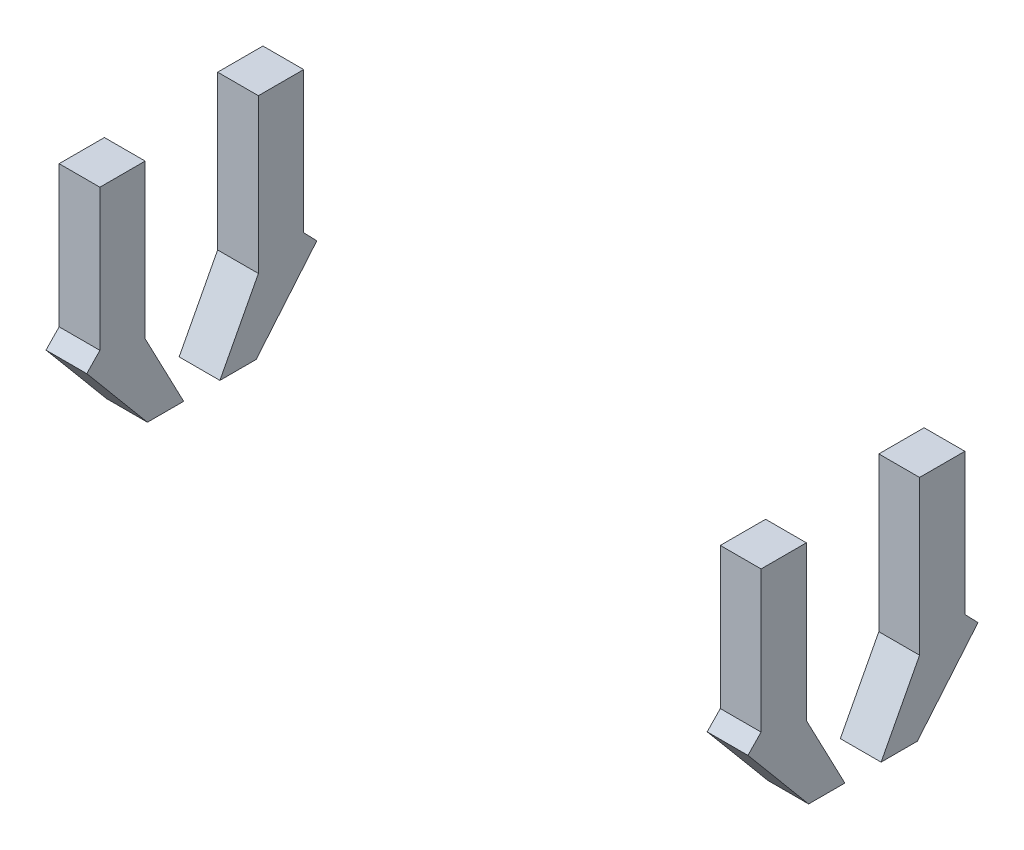
ISO-10303-21;
HEADER;
FILE_DESCRIPTION(('STEP AP214'),'2;1');
FILE_NAME('part.step','',(''),(''),'','','');
FILE_SCHEMA(('AUTOMOTIVE_DESIGN { 1 0 10303 214 1 1 1 1 }'));
ENDSEC;
DATA;
#1=APPLICATION_CONTEXT('core data for automotive mechanical design processes');
#2=APPLICATION_PROTOCOL_DEFINITION('international standard','automotive_design',2000,#1);
#3=PRODUCT_CONTEXT('',#1,'mechanical');
#4=PRODUCT('Part','Part','',(#3));
#5=PRODUCT_RELATED_PRODUCT_CATEGORY('part','',(#4));
#6=PRODUCT_DEFINITION_FORMATION('','',#4);
#7=PRODUCT_DEFINITION_CONTEXT('part definition',#1,'design');
#8=PRODUCT_DEFINITION('design','',#6,#7);
#9=PRODUCT_DEFINITION_SHAPE('','',#8);
#10=(LENGTH_UNIT() NAMED_UNIT(*) SI_UNIT(.MILLI.,.METRE.));
#11=(NAMED_UNIT(*) PLANE_ANGLE_UNIT() SI_UNIT($,.RADIAN.));
#12=(NAMED_UNIT(*) SI_UNIT($,.STERADIAN.) SOLID_ANGLE_UNIT());
#13=UNCERTAINTY_MEASURE_WITH_UNIT(LENGTH_MEASURE(1.E-05),#10,'distance_accuracy_value','');
#14=(GEOMETRIC_REPRESENTATION_CONTEXT(3) GLOBAL_UNCERTAINTY_ASSIGNED_CONTEXT((#13)) GLOBAL_UNIT_ASSIGNED_CONTEXT((#10,
#11,#12)) REPRESENTATION_CONTEXT('',''));
#15=CARTESIAN_POINT('',(0.,0.,0.));
#16=DIRECTION('',(0.,0.,1.));
#17=DIRECTION('',(1.,0.,0.));
#18=AXIS2_PLACEMENT_3D('',#15,#16,#17);
#19=CARTESIAN_POINT('',(-3.425,-3.43,1.48));
#20=DIRECTION('',(0.,0.,-1.));
#21=DIRECTION('',(0.,-1.,0.));
#22=AXIS2_PLACEMENT_3D('',#19,#20,#21);
#23=PLANE('',#22);
#24=DIRECTION('',(1.,0.,0.));
#25=VECTOR('',#24,1.);
#26=CARTESIAN_POINT('',(-3.875,-3.43,1.48));
#27=LINE('',#26,#25);
#28=CARTESIAN_POINT('',(-3.875,-3.43,1.48));
#29=VERTEX_POINT('',#28);
#30=CARTESIAN_POINT('',(-3.425,-3.43,1.48));
#31=VERTEX_POINT('',#30);
#32=EDGE_CURVE('P0_E101',#29,#31,#27,.T.);
#33=ORIENTED_EDGE('',*,*,#32,.F.);
#34=DIRECTION('',(0.,-1.,0.));
#35=VECTOR('',#34,1.);
#36=CARTESIAN_POINT('',(-3.875,-3.43,1.48));
#37=LINE('',#36,#35);
#38=CARTESIAN_POINT('',(-3.875,-4.99,1.48));
#39=VERTEX_POINT('',#38);
#40=EDGE_CURVE('P0_E144',#29,#39,#37,.T.);
#41=ORIENTED_EDGE('',*,*,#40,.T.);
#42=DIRECTION('',(-1.,0.,0.));
#43=VECTOR('',#42,1.);
#44=CARTESIAN_POINT('',(-3.425,-4.99,1.48));
#45=LINE('',#44,#43);
#46=CARTESIAN_POINT('',(-3.425,-4.99,1.48));
#47=VERTEX_POINT('',#46);
#48=EDGE_CURVE('P0_E11',#47,#39,#45,.T.);
#49=ORIENTED_EDGE('',*,*,#48,.F.);
#50=DIRECTION('',(0.,-1.,0.));
#51=VECTOR('',#50,1.);
#52=CARTESIAN_POINT('',(-3.425,-3.43,1.48));
#53=LINE('',#52,#51);
#54=EDGE_CURVE('P0_E97',#31,#47,#53,.T.);
#55=ORIENTED_EDGE('',*,*,#54,.F.);
#56=EDGE_LOOP('',(#33,#41,#49,#55));
#57=FACE_BOUND('',#56,.T.);
#58=ADVANCED_FACE('P0_F17',(#57),#23,.F.);
#59=CARTESIAN_POINT('',(-3.425,-4.99,1.48));
#60=DIRECTION('',(0.,-0.695022096847285,-0.718988376049295));
#61=DIRECTION('',(0.,-0.718988376049295,0.695022096847285));
#62=AXIS2_PLACEMENT_3D('',#59,#60,#61);
#63=PLANE('',#62);
#64=DIRECTION('',(0.,-0.718988376049295,0.695022096847285));
#65=VECTOR('',#64,1.);
#66=CARTESIAN_POINT('',(-3.425,-4.99,1.48));
#67=LINE('',#66,#65);
#68=CARTESIAN_POINT('',(-3.425,-5.14,1.625));
#69=VERTEX_POINT('',#68);
#70=EDGE_CURVE('P0_E107',#47,#69,#67,.T.);
#71=ORIENTED_EDGE('',*,*,#70,.F.);
#72=ORIENTED_EDGE('',*,*,#48,.T.);
#73=DIRECTION('',(0.,-0.718988376049295,0.695022096847285));
#74=VECTOR('',#73,1.);
#75=CARTESIAN_POINT('',(-3.875,-4.99,1.48));
#76=LINE('',#75,#74);
#77=CARTESIAN_POINT('',(-3.875,-5.14,1.625));
#78=VERTEX_POINT('',#77);
#79=EDGE_CURVE('P0_E151',#39,#78,#76,.T.);
#80=ORIENTED_EDGE('',*,*,#79,.T.);
#81=DIRECTION('',(-1.,0.,0.));
#82=VECTOR('',#81,1.);
#83=CARTESIAN_POINT('',(-3.425,-5.14,1.625));
#84=LINE('',#83,#82);
#85=EDGE_CURVE('P0_E26',#69,#78,#84,.T.);
#86=ORIENTED_EDGE('',*,*,#85,.F.);
#87=EDGE_LOOP('',(#71,#72,#80,#86));
#88=FACE_BOUND('',#87,.T.);
#89=ADVANCED_FACE('P0_F19',(#88),#63,.F.);
#90=CARTESIAN_POINT('',(-3.425,-5.14,1.625));
#91=DIRECTION('',(0.,0.642067671977776,-0.766647966540732));
#92=DIRECTION('',(-1.,0.,0.));
#93=AXIS2_PLACEMENT_3D('',#90,#91,#92);
#94=PLANE('',#93);
#95=DIRECTION('',(0.,-0.766647966540732,-0.642067671977776));
#96=VECTOR('',#95,1.);
#97=CARTESIAN_POINT('',(-3.425,-5.14,1.625));
#98=LINE('',#97,#96);
#99=CARTESIAN_POINT('',(-3.425,-5.94,0.955));
#100=VERTEX_POINT('',#99);
#101=EDGE_CURVE('P0_E147',#69,#100,#98,.T.);
#102=ORIENTED_EDGE('',*,*,#101,.F.);
#103=ORIENTED_EDGE('',*,*,#85,.T.);
#104=DIRECTION('',(0.,-0.766647966540732,-0.642067671977776));
#105=VECTOR('',#104,1.);
#106=CARTESIAN_POINT('',(-3.875,-5.14,1.625));
#107=LINE('',#106,#105);
#108=CARTESIAN_POINT('',(-3.875,-5.94,0.955));
#109=VERTEX_POINT('',#108);
#110=EDGE_CURVE('P0_E150',#78,#109,#107,.T.);
#111=ORIENTED_EDGE('',*,*,#110,.T.);
#112=DIRECTION('',(-1.,0.,0.));
#113=VECTOR('',#112,1.);
#114=CARTESIAN_POINT('',(-3.425,-5.94,0.955));
#115=LINE('',#114,#113);
#116=EDGE_CURVE('P0_E48',#100,#109,#115,.T.);
#117=ORIENTED_EDGE('',*,*,#116,.F.);
#118=EDGE_LOOP('',(#102,#103,#111,#117));
#119=FACE_BOUND('',#118,.T.);
#120=ADVANCED_FACE('P0_F170',(#119),#94,.F.);
#121=CARTESIAN_POINT('',(-3.425,-5.94,0.955));
#122=DIRECTION('',(0.,1.,0.));
#123=DIRECTION('',(1.,0.,0.));
#124=AXIS2_PLACEMENT_3D('',#121,#122,#123);
#125=PLANE('',#124);
#126=DIRECTION('',(0.,0.,-1.));
#127=VECTOR('',#126,1.);
#128=CARTESIAN_POINT('',(-3.425,-5.94,0.955));
#129=LINE('',#128,#127);
#130=CARTESIAN_POINT('',(-3.425,-5.94,0.555));
#131=VERTEX_POINT('',#130);
#132=EDGE_CURVE('P0_E134',#100,#131,#129,.T.);
#133=ORIENTED_EDGE('',*,*,#132,.F.);
#134=ORIENTED_EDGE('',*,*,#116,.T.);
#135=DIRECTION('',(0.,0.,-1.));
#136=VECTOR('',#135,1.);
#137=CARTESIAN_POINT('',(-3.875,-5.94,0.955));
#138=LINE('',#137,#136);
#139=CARTESIAN_POINT('',(-3.875,-5.94,0.555));
#140=VERTEX_POINT('',#139);
#141=EDGE_CURVE('P0_E141',#109,#140,#138,.T.);
#142=ORIENTED_EDGE('',*,*,#141,.T.);
#143=DIRECTION('',(-1.,0.,0.));
#144=VECTOR('',#143,1.);
#145=CARTESIAN_POINT('',(-3.425,-5.94,0.555));
#146=LINE('',#145,#144);
#147=EDGE_CURVE('P0_E38',#131,#140,#146,.T.);
#148=ORIENTED_EDGE('',*,*,#147,.F.);
#149=EDGE_LOOP('',(#133,#134,#142,#148));
#150=FACE_BOUND('',#149,.T.);
#151=ADVANCED_FACE('P0_F194',(#150),#125,.F.);
#152=CARTESIAN_POINT('',(-3.425,-5.94,0.555));
#153=DIRECTION('',(0.,-0.464619633020914,0.885510359403836));
#154=DIRECTION('',(-1.,0.,0.));
#155=AXIS2_PLACEMENT_3D('',#152,#153,#154);
#156=PLANE('',#155);
#157=DIRECTION('',(0.,0.885510359403836,0.464619633020914));
#158=VECTOR('',#157,1.);
#159=CARTESIAN_POINT('',(-3.425,-5.94,0.555));
#160=LINE('',#159,#158);
#161=CARTESIAN_POINT('',(-3.425,-5.13,0.98));
#162=VERTEX_POINT('',#161);
#163=EDGE_CURVE('P0_E160',#131,#162,#160,.T.);
#164=ORIENTED_EDGE('',*,*,#163,.F.);
#165=ORIENTED_EDGE('',*,*,#147,.T.);
#166=DIRECTION('',(0.,0.885510359403836,0.464619633020914));
#167=VECTOR('',#166,1.);
#168=CARTESIAN_POINT('',(-3.875,-5.94,0.555));
#169=LINE('',#168,#167);
#170=CARTESIAN_POINT('',(-3.875,-5.13,0.98));
#171=VERTEX_POINT('',#170);
#172=EDGE_CURVE('P0_E137',#140,#171,#169,.T.);
#173=ORIENTED_EDGE('',*,*,#172,.T.);
#174=DIRECTION('',(-1.,0.,0.));
#175=VECTOR('',#174,1.);
#176=CARTESIAN_POINT('',(-3.425,-5.13,0.98));
#177=LINE('',#176,#175);
#178=EDGE_CURVE('P0_E163',#162,#171,#177,.T.);
#179=ORIENTED_EDGE('',*,*,#178,.F.);
#180=EDGE_LOOP('',(#164,#165,#173,#179));
#181=FACE_BOUND('',#180,.T.);
#182=ADVANCED_FACE('P0_F192',(#181),#156,.F.);
#183=CARTESIAN_POINT('',(-3.425,-5.13,0.98));
#184=DIRECTION('',(0.,0.,1.));
#185=DIRECTION('',(1.,0.,0.));
#186=AXIS2_PLACEMENT_3D('',#183,#184,#185);
#187=PLANE('',#186);
#188=DIRECTION('',(1.,0.,0.));
#189=VECTOR('',#188,1.);
#190=CARTESIAN_POINT('',(-3.875,-3.43,0.98));
#191=LINE('',#190,#189);
#192=CARTESIAN_POINT('',(-3.875,-3.43,0.98));
#193=VERTEX_POINT('',#192);
#194=CARTESIAN_POINT('',(-3.425,-3.43,0.98));
#195=VERTEX_POINT('',#194);
#196=EDGE_CURVE('P0_E130',#193,#195,#191,.T.);
#197=ORIENTED_EDGE('',*,*,#196,.T.);
#198=DIRECTION('',(0.,1.,0.));
#199=VECTOR('',#198,1.);
#200=CARTESIAN_POINT('',(-3.425,-5.13,0.98));
#201=LINE('',#200,#199);
#202=EDGE_CURVE('P0_E108',#162,#195,#201,.T.);
#203=ORIENTED_EDGE('',*,*,#202,.F.);
#204=ORIENTED_EDGE('',*,*,#178,.T.);
#205=DIRECTION('',(0.,1.,0.));
#206=VECTOR('',#205,1.);
#207=CARTESIAN_POINT('',(-3.875,-5.13,0.98));
#208=LINE('',#207,#206);
#209=EDGE_CURVE('P0_E119',#171,#193,#208,.T.);
#210=ORIENTED_EDGE('',*,*,#209,.T.);
#211=EDGE_LOOP('',(#197,#203,#204,#210));
#212=FACE_BOUND('',#211,.T.);
#213=ADVANCED_FACE('P0_F190',(#212),#187,.F.);
#214=CARTESIAN_POINT('',(-3.425,0.,0.));
#215=DIRECTION('',(1.,0.,0.));
#216=DIRECTION('',(0.,1.,0.));
#217=AXIS2_PLACEMENT_3D('',#214,#215,#216);
#218=PLANE('',#217);
#219=ORIENTED_EDGE('',*,*,#202,.T.);
#220=DIRECTION('',(0.,0.,-1.));
#221=VECTOR('',#220,1.);
#222=CARTESIAN_POINT('',(-3.425,-3.43,1.48));
#223=LINE('',#222,#221);
#224=EDGE_CURVE('P0_E111',#31,#195,#223,.T.);
#225=ORIENTED_EDGE('',*,*,#224,.F.);
#226=ORIENTED_EDGE('',*,*,#54,.T.);
#227=ORIENTED_EDGE('',*,*,#70,.T.);
#228=ORIENTED_EDGE('',*,*,#101,.T.);
#229=ORIENTED_EDGE('',*,*,#132,.T.);
#230=ORIENTED_EDGE('',*,*,#163,.T.);
#231=EDGE_LOOP('',(#219,#225,#226,#227,#228,#229,#230));
#232=FACE_BOUND('',#231,.T.);
#233=ADVANCED_FACE('P0_F112',(#232),#218,.T.);
#234=CARTESIAN_POINT('',(-3.875,0.,0.));
#235=DIRECTION('',(1.,0.,0.));
#236=DIRECTION('',(0.,1.,0.));
#237=AXIS2_PLACEMENT_3D('',#234,#235,#236);
#238=PLANE('',#237);
#239=ORIENTED_EDGE('',*,*,#209,.F.);
#240=ORIENTED_EDGE('',*,*,#172,.F.);
#241=ORIENTED_EDGE('',*,*,#141,.F.);
#242=ORIENTED_EDGE('',*,*,#110,.F.);
#243=ORIENTED_EDGE('',*,*,#79,.F.);
#244=ORIENTED_EDGE('',*,*,#40,.F.);
#245=DIRECTION('',(0.,0.,-1.));
#246=VECTOR('',#245,1.);
#247=CARTESIAN_POINT('',(-3.875,-3.43,1.48));
#248=LINE('',#247,#246);
#249=EDGE_CURVE('P0_E123',#29,#193,#248,.T.);
#250=ORIENTED_EDGE('',*,*,#249,.T.);
#251=EDGE_LOOP('',(#239,#240,#241,#242,#243,#244,#250));
#252=FACE_BOUND('',#251,.T.);
#253=ADVANCED_FACE('P0_F177',(#252),#238,.F.);
#254=CARTESIAN_POINT('',(-3.281838299434,-3.43,1.624574185771));
#255=DIRECTION('',(0.,1.,0.));
#256=DIRECTION('',(1.,0.,0.));
#257=AXIS2_PLACEMENT_3D('',#254,#255,#256);
#258=PLANE('',#257);
#259=ORIENTED_EDGE('',*,*,#196,.F.);
#260=ORIENTED_EDGE('',*,*,#249,.F.);
#261=ORIENTED_EDGE('',*,*,#32,.T.);
#262=ORIENTED_EDGE('',*,*,#224,.T.);
#263=EDGE_LOOP('',(#259,#260,#261,#262));
#264=FACE_BOUND('',#263,.T.);
#265=ADVANCED_FACE('P0_F121',(#264),#258,.T.);
#266=CLOSED_SHELL('',(#58,#89,#120,#151,#182,#213,#233,#253,#265));
#267=MANIFOLD_SOLID_BREP('P0_B1',#266);
#268=CARTESIAN_POINT('',(2.93914547999,-3.43,1.870179127179));
#269=DIRECTION('',(0.,1.,0.));
#270=DIRECTION('',(1.,0.,0.));
#271=AXIS2_PLACEMENT_3D('',#268,#269,#270);
#272=PLANE('',#271);
#273=DIRECTION('',(-1.,0.,0.));
#274=VECTOR('',#273,1.);
#275=CARTESIAN_POINT('',(3.875,-3.43,1.48));
#276=LINE('',#275,#274);
#277=CARTESIAN_POINT('',(3.875,-3.43,1.48));
#278=VERTEX_POINT('',#277);
#279=CARTESIAN_POINT('',(3.425,-3.43,1.48));
#280=VERTEX_POINT('',#279);
#281=EDGE_CURVE('P1_E83',#278,#280,#276,.T.);
#282=ORIENTED_EDGE('',*,*,#281,.F.);
#283=DIRECTION('',(0.,0.,-1.));
#284=VECTOR('',#283,1.);
#285=CARTESIAN_POINT('',(3.875,-3.43,1.48));
#286=LINE('',#285,#284);
#287=CARTESIAN_POINT('',(3.875,-3.43,0.98));
#288=VERTEX_POINT('',#287);
#289=EDGE_CURVE('P1_E11',#278,#288,#286,.T.);
#290=ORIENTED_EDGE('',*,*,#289,.T.);
#291=DIRECTION('',(-1.,0.,0.));
#292=VECTOR('',#291,1.);
#293=CARTESIAN_POINT('',(3.875,-3.43,0.98));
#294=LINE('',#293,#292);
#295=CARTESIAN_POINT('',(3.425,-3.43,0.98));
#296=VERTEX_POINT('',#295);
#297=EDGE_CURVE('P1_E110',#288,#296,#294,.T.);
#298=ORIENTED_EDGE('',*,*,#297,.T.);
#299=DIRECTION('',(0.,0.,-1.));
#300=VECTOR('',#299,1.);
#301=CARTESIAN_POINT('',(3.425,-3.43,1.48));
#302=LINE('',#301,#300);
#303=EDGE_CURVE('P1_E72',#280,#296,#302,.T.);
#304=ORIENTED_EDGE('',*,*,#303,.F.);
#305=EDGE_LOOP('',(#282,#290,#298,#304));
#306=FACE_BOUND('',#305,.T.);
#307=ADVANCED_FACE('P1_F17',(#306),#272,.T.);
#308=CARTESIAN_POINT('',(3.875,0.,0.));
#309=DIRECTION('',(1.,0.,0.));
#310=DIRECTION('',(0.,1.,0.));
#311=AXIS2_PLACEMENT_3D('',#308,#309,#310);
#312=PLANE('',#311);
#313=ORIENTED_EDGE('',*,*,#289,.F.);
#314=DIRECTION('',(0.,-1.,0.));
#315=VECTOR('',#314,1.);
#316=CARTESIAN_POINT('',(3.875,-3.43,1.48));
#317=LINE('',#316,#315);
#318=CARTESIAN_POINT('',(3.875,-4.99,1.48));
#319=VERTEX_POINT('',#318);
#320=EDGE_CURVE('P1_E62',#278,#319,#317,.T.);
#321=ORIENTED_EDGE('',*,*,#320,.T.);
#322=DIRECTION('',(0.,-0.718988376049295,0.695022096847285));
#323=VECTOR('',#322,1.);
#324=CARTESIAN_POINT('',(3.875,-4.99,1.48));
#325=LINE('',#324,#323);
#326=CARTESIAN_POINT('',(3.875,-5.14,1.625));
#327=VERTEX_POINT('',#326);
#328=EDGE_CURVE('P1_E67',#319,#327,#325,.T.);
#329=ORIENTED_EDGE('',*,*,#328,.T.);
#330=DIRECTION('',(0.,-0.766647966540732,-0.642067671977776));
#331=VECTOR('',#330,1.);
#332=CARTESIAN_POINT('',(3.875,-5.14,1.625));
#333=LINE('',#332,#331);
#334=CARTESIAN_POINT('',(3.875,-5.94,0.955));
#335=VERTEX_POINT('',#334);
#336=EDGE_CURVE('P1_E140',#327,#335,#333,.T.);
#337=ORIENTED_EDGE('',*,*,#336,.T.);
#338=DIRECTION('',(0.,0.,-1.));
#339=VECTOR('',#338,1.);
#340=CARTESIAN_POINT('',(3.875,-5.94,0.955));
#341=LINE('',#340,#339);
#342=CARTESIAN_POINT('',(3.875,-5.94,0.555));
#343=VERTEX_POINT('',#342);
#344=EDGE_CURVE('P1_E150',#335,#343,#341,.T.);
#345=ORIENTED_EDGE('',*,*,#344,.T.);
#346=DIRECTION('',(0.,0.885510359403836,0.464619633020914));
#347=VECTOR('',#346,1.);
#348=CARTESIAN_POINT('',(3.875,-5.94,0.555));
#349=LINE('',#348,#347);
#350=CARTESIAN_POINT('',(3.875,-5.13,0.98));
#351=VERTEX_POINT('',#350);
#352=EDGE_CURVE('P1_E121',#343,#351,#349,.T.);
#353=ORIENTED_EDGE('',*,*,#352,.T.);
#354=DIRECTION('',(0.,1.,0.));
#355=VECTOR('',#354,1.);
#356=CARTESIAN_POINT('',(3.875,-5.13,0.98));
#357=LINE('',#356,#355);
#358=EDGE_CURVE('P1_E26',#351,#288,#357,.T.);
#359=ORIENTED_EDGE('',*,*,#358,.T.);
#360=EDGE_LOOP('',(#313,#321,#329,#337,#345,#353,#359));
#361=FACE_BOUND('',#360,.T.);
#362=ADVANCED_FACE('P1_F64',(#361),#312,.T.);
#363=CARTESIAN_POINT('',(3.425,-5.13,0.98));
#364=DIRECTION('',(0.,0.,-1.));
#365=DIRECTION('',(0.,-1.,0.));
#366=AXIS2_PLACEMENT_3D('',#363,#364,#365);
#367=PLANE('',#366);
#368=ORIENTED_EDGE('',*,*,#297,.F.);
#369=ORIENTED_EDGE('',*,*,#358,.F.);
#370=DIRECTION('',(1.,0.,0.));
#371=VECTOR('',#370,1.);
#372=CARTESIAN_POINT('',(3.425,-5.13,0.98));
#373=LINE('',#372,#371);
#374=CARTESIAN_POINT('',(3.425,-5.13,0.98));
#375=VERTEX_POINT('',#374);
#376=EDGE_CURVE('P1_E162',#375,#351,#373,.T.);
#377=ORIENTED_EDGE('',*,*,#376,.F.);
#378=DIRECTION('',(0.,1.,0.));
#379=VECTOR('',#378,1.);
#380=CARTESIAN_POINT('',(3.425,-5.13,0.98));
#381=LINE('',#380,#379);
#382=EDGE_CURVE('P1_E106',#375,#296,#381,.T.);
#383=ORIENTED_EDGE('',*,*,#382,.T.);
#384=EDGE_LOOP('',(#368,#369,#377,#383));
#385=FACE_BOUND('',#384,.T.);
#386=ADVANCED_FACE('P1_F125',(#385),#367,.T.);
#387=CARTESIAN_POINT('',(3.425,0.,0.));
#388=DIRECTION('',(1.,0.,0.));
#389=DIRECTION('',(0.,1.,0.));
#390=AXIS2_PLACEMENT_3D('',#387,#388,#389);
#391=PLANE('',#390);
#392=ORIENTED_EDGE('',*,*,#303,.T.);
#393=ORIENTED_EDGE('',*,*,#382,.F.);
#394=DIRECTION('',(0.,0.885510359403836,0.464619633020914));
#395=VECTOR('',#394,1.);
#396=CARTESIAN_POINT('',(3.425,-5.94,0.555));
#397=LINE('',#396,#395);
#398=CARTESIAN_POINT('',(3.425,-5.94,0.555));
#399=VERTEX_POINT('',#398);
#400=EDGE_CURVE('P1_E165',#399,#375,#397,.T.);
#401=ORIENTED_EDGE('',*,*,#400,.F.);
#402=DIRECTION('',(0.,0.,-1.));
#403=VECTOR('',#402,1.);
#404=CARTESIAN_POINT('',(3.425,-5.94,0.955));
#405=LINE('',#404,#403);
#406=CARTESIAN_POINT('',(3.425,-5.94,0.955));
#407=VERTEX_POINT('',#406);
#408=EDGE_CURVE('P1_E153',#407,#399,#405,.T.);
#409=ORIENTED_EDGE('',*,*,#408,.F.);
#410=DIRECTION('',(0.,-0.766647966540732,-0.642067671977776));
#411=VECTOR('',#410,1.);
#412=CARTESIAN_POINT('',(3.425,-5.14,1.625));
#413=LINE('',#412,#411);
#414=CARTESIAN_POINT('',(3.425,-5.14,1.625));
#415=VERTEX_POINT('',#414);
#416=EDGE_CURVE('P1_E133',#415,#407,#413,.T.);
#417=ORIENTED_EDGE('',*,*,#416,.F.);
#418=DIRECTION('',(0.,-0.718988376049295,0.695022096847285));
#419=VECTOR('',#418,1.);
#420=CARTESIAN_POINT('',(3.425,-4.99,1.48));
#421=LINE('',#420,#419);
#422=CARTESIAN_POINT('',(3.425,-4.99,1.48));
#423=VERTEX_POINT('',#422);
#424=EDGE_CURVE('P1_E90',#423,#415,#421,.T.);
#425=ORIENTED_EDGE('',*,*,#424,.F.);
#426=DIRECTION('',(0.,-1.,0.));
#427=VECTOR('',#426,1.);
#428=CARTESIAN_POINT('',(3.425,-3.43,1.48));
#429=LINE('',#428,#427);
#430=EDGE_CURVE('P1_E73',#280,#423,#429,.T.);
#431=ORIENTED_EDGE('',*,*,#430,.F.);
#432=EDGE_LOOP('',(#392,#393,#401,#409,#417,#425,#431));
#433=FACE_BOUND('',#432,.T.);
#434=ADVANCED_FACE('P1_F129',(#433),#391,.F.);
#435=CARTESIAN_POINT('',(3.425,-3.43,1.48));
#436=DIRECTION('',(0.,0.,1.));
#437=DIRECTION('',(1.,0.,0.));
#438=AXIS2_PLACEMENT_3D('',#435,#436,#437);
#439=PLANE('',#438);
#440=ORIENTED_EDGE('',*,*,#281,.T.);
#441=ORIENTED_EDGE('',*,*,#430,.T.);
#442=DIRECTION('',(1.,0.,0.));
#443=VECTOR('',#442,1.);
#444=CARTESIAN_POINT('',(3.425,-4.99,1.48));
#445=LINE('',#444,#443);
#446=EDGE_CURVE('P1_E76',#423,#319,#445,.T.);
#447=ORIENTED_EDGE('',*,*,#446,.T.);
#448=ORIENTED_EDGE('',*,*,#320,.F.);
#449=EDGE_LOOP('',(#440,#441,#447,#448));
#450=FACE_BOUND('',#449,.T.);
#451=ADVANCED_FACE('P1_F77',(#450),#439,.T.);
#452=CARTESIAN_POINT('',(3.425,-4.99,1.48));
#453=DIRECTION('',(0.,0.695022096847285,0.718988376049295));
#454=DIRECTION('',(1.,0.,0.));
#455=AXIS2_PLACEMENT_3D('',#452,#453,#454);
#456=PLANE('',#455);
#457=ORIENTED_EDGE('',*,*,#424,.T.);
#458=DIRECTION('',(1.,0.,0.));
#459=VECTOR('',#458,1.);
#460=CARTESIAN_POINT('',(3.425,-5.14,1.625));
#461=LINE('',#460,#459);
#462=EDGE_CURVE('P1_E87',#415,#327,#461,.T.);
#463=ORIENTED_EDGE('',*,*,#462,.T.);
#464=ORIENTED_EDGE('',*,*,#328,.F.);
#465=ORIENTED_EDGE('',*,*,#446,.F.);
#466=EDGE_LOOP('',(#457,#463,#464,#465));
#467=FACE_BOUND('',#466,.T.);
#468=ADVANCED_FACE('P1_F85',(#467),#456,.T.);
#469=CARTESIAN_POINT('',(3.425,-5.14,1.625));
#470=DIRECTION('',(0.,-0.642067671977776,0.766647966540732));
#471=DIRECTION('',(-1.,0.,0.));
#472=AXIS2_PLACEMENT_3D('',#469,#470,#471);
#473=PLANE('',#472);
#474=ORIENTED_EDGE('',*,*,#416,.T.);
#475=DIRECTION('',(1.,0.,0.));
#476=VECTOR('',#475,1.);
#477=CARTESIAN_POINT('',(3.425,-5.94,0.955));
#478=LINE('',#477,#476);
#479=EDGE_CURVE('P1_E147',#407,#335,#478,.T.);
#480=ORIENTED_EDGE('',*,*,#479,.T.);
#481=ORIENTED_EDGE('',*,*,#336,.F.);
#482=ORIENTED_EDGE('',*,*,#462,.F.);
#483=EDGE_LOOP('',(#474,#480,#481,#482));
#484=FACE_BOUND('',#483,.T.);
#485=ADVANCED_FACE('P1_F136',(#484),#473,.T.);
#486=CARTESIAN_POINT('',(3.425,-5.94,0.955));
#487=DIRECTION('',(0.,-1.,0.));
#488=DIRECTION('',(0.,0.,-1.));
#489=AXIS2_PLACEMENT_3D('',#486,#487,#488);
#490=PLANE('',#489);
#491=ORIENTED_EDGE('',*,*,#408,.T.);
#492=DIRECTION('',(1.,0.,0.));
#493=VECTOR('',#492,1.);
#494=CARTESIAN_POINT('',(3.425,-5.94,0.555));
#495=LINE('',#494,#493);
#496=EDGE_CURVE('P1_E157',#399,#343,#495,.T.);
#497=ORIENTED_EDGE('',*,*,#496,.T.);
#498=ORIENTED_EDGE('',*,*,#344,.F.);
#499=ORIENTED_EDGE('',*,*,#479,.F.);
#500=EDGE_LOOP('',(#491,#497,#498,#499));
#501=FACE_BOUND('',#500,.T.);
#502=ADVANCED_FACE('P1_F196',(#501),#490,.T.);
#503=CARTESIAN_POINT('',(3.425,-5.94,0.555));
#504=DIRECTION('',(0.,0.464619633020914,-0.885510359403836));
#505=DIRECTION('',(-1.,0.,0.));
#506=AXIS2_PLACEMENT_3D('',#503,#504,#505);
#507=PLANE('',#506);
#508=ORIENTED_EDGE('',*,*,#400,.T.);
#509=ORIENTED_EDGE('',*,*,#376,.T.);
#510=ORIENTED_EDGE('',*,*,#352,.F.);
#511=ORIENTED_EDGE('',*,*,#496,.F.);
#512=EDGE_LOOP('',(#508,#509,#510,#511));
#513=FACE_BOUND('',#512,.T.);
#514=ADVANCED_FACE('P1_F177',(#513),#507,.T.);
#515=CLOSED_SHELL('',(#307,#362,#386,#434,#451,#468,#485,#502,#514));
#516=MANIFOLD_SOLID_BREP('P1_B1',#515);
#517=CARTESIAN_POINT('',(-3.425,-5.13,-0.27));
#518=DIRECTION('',(0.,-0.464619633020914,-0.885510359403836));
#519=DIRECTION('',(0.,-0.885510359403836,0.464619633020914));
#520=AXIS2_PLACEMENT_3D('',#517,#518,#519);
#521=PLANE('',#520);
#522=DIRECTION('',(0.,-0.885510359403836,0.464619633020914));
#523=VECTOR('',#522,1.);
#524=CARTESIAN_POINT('',(-3.425,-5.13,-0.27));
#525=LINE('',#524,#523);
#526=CARTESIAN_POINT('',(-3.425,-5.13,-0.27));
#527=VERTEX_POINT('',#526);
#528=CARTESIAN_POINT('',(-3.425,-5.94,0.155));
#529=VERTEX_POINT('',#528);
#530=EDGE_CURVE('P2_E139',#527,#529,#525,.T.);
#531=ORIENTED_EDGE('',*,*,#530,.F.);
#532=DIRECTION('',(-1.,0.,0.));
#533=VECTOR('',#532,1.);
#534=CARTESIAN_POINT('',(-3.425,-5.13,-0.27));
#535=LINE('',#534,#533);
#536=CARTESIAN_POINT('',(-3.875,-5.13,-0.27));
#537=VERTEX_POINT('',#536);
#538=EDGE_CURVE('P2_E132',#527,#537,#535,.T.);
#539=ORIENTED_EDGE('',*,*,#538,.T.);
#540=DIRECTION('',(0.,-0.885510359403836,0.464619633020914));
#541=VECTOR('',#540,1.);
#542=CARTESIAN_POINT('',(-3.875,-5.13,-0.27));
#543=LINE('',#542,#541);
#544=CARTESIAN_POINT('',(-3.875,-5.94,0.155));
#545=VERTEX_POINT('',#544);
#546=EDGE_CURVE('P2_E127',#537,#545,#543,.T.);
#547=ORIENTED_EDGE('',*,*,#546,.T.);
#548=DIRECTION('',(-1.,0.,0.));
#549=VECTOR('',#548,1.);
#550=CARTESIAN_POINT('',(-3.425,-5.94,0.155));
#551=LINE('',#550,#549);
#552=EDGE_CURVE('P2_E11',#529,#545,#551,.T.);
#553=ORIENTED_EDGE('',*,*,#552,.F.);
#554=EDGE_LOOP('',(#531,#539,#547,#553));
#555=FACE_BOUND('',#554,.T.);
#556=ADVANCED_FACE('P2_F17',(#555),#521,.F.);
#557=CARTESIAN_POINT('',(-3.425,-5.94,0.155));
#558=DIRECTION('',(0.,1.,0.));
#559=DIRECTION('',(1.,0.,0.));
#560=AXIS2_PLACEMENT_3D('',#557,#558,#559);
#561=PLANE('',#560);
#562=DIRECTION('',(0.,0.,-1.));
#563=VECTOR('',#562,1.);
#564=CARTESIAN_POINT('',(-3.425,-5.94,0.155));
#565=LINE('',#564,#563);
#566=CARTESIAN_POINT('',(-3.425,-5.94,-0.245));
#567=VERTEX_POINT('',#566);
#568=EDGE_CURVE('P2_E143',#529,#567,#565,.T.);
#569=ORIENTED_EDGE('',*,*,#568,.F.);
#570=ORIENTED_EDGE('',*,*,#552,.T.);
#571=DIRECTION('',(0.,0.,-1.));
#572=VECTOR('',#571,1.);
#573=CARTESIAN_POINT('',(-3.875,-5.94,0.155));
#574=LINE('',#573,#572);
#575=CARTESIAN_POINT('',(-3.875,-5.94,-0.245));
#576=VERTEX_POINT('',#575);
#577=EDGE_CURVE('P2_E109',#545,#576,#574,.T.);
#578=ORIENTED_EDGE('',*,*,#577,.T.);
#579=DIRECTION('',(-1.,0.,0.));
#580=VECTOR('',#579,1.);
#581=CARTESIAN_POINT('',(-3.425,-5.94,-0.245));
#582=LINE('',#581,#580);
#583=EDGE_CURVE('P2_E26',#567,#576,#582,.T.);
#584=ORIENTED_EDGE('',*,*,#583,.F.);
#585=EDGE_LOOP('',(#569,#570,#578,#584));
#586=FACE_BOUND('',#585,.T.);
#587=ADVANCED_FACE('P2_F19',(#586),#561,.F.);
#588=CARTESIAN_POINT('',(-3.425,-5.94,-0.245));
#589=DIRECTION('',(0.,0.642067671977776,0.766647966540732));
#590=DIRECTION('',(1.,0.,0.));
#591=AXIS2_PLACEMENT_3D('',#588,#589,#590);
#592=PLANE('',#591);
#593=DIRECTION('',(0.,0.766647966540732,-0.642067671977776));
#594=VECTOR('',#593,1.);
#595=CARTESIAN_POINT('',(-3.425,-5.94,-0.245));
#596=LINE('',#595,#594);
#597=CARTESIAN_POINT('',(-3.425,-5.14,-0.915));
#598=VERTEX_POINT('',#597);
#599=EDGE_CURVE('P2_E140',#567,#598,#596,.T.);
#600=ORIENTED_EDGE('',*,*,#599,.F.);
#601=ORIENTED_EDGE('',*,*,#583,.T.);
#602=DIRECTION('',(0.,0.766647966540732,-0.642067671977776));
#603=VECTOR('',#602,1.);
#604=CARTESIAN_POINT('',(-3.875,-5.94,-0.245));
#605=LINE('',#604,#603);
#606=CARTESIAN_POINT('',(-3.875,-5.14,-0.915));
#607=VERTEX_POINT('',#606);
#608=EDGE_CURVE('P2_E104',#576,#607,#605,.T.);
#609=ORIENTED_EDGE('',*,*,#608,.T.);
#610=DIRECTION('',(-1.,0.,0.));
#611=VECTOR('',#610,1.);
#612=CARTESIAN_POINT('',(-3.425,-5.14,-0.915));
#613=LINE('',#612,#611);
#614=EDGE_CURVE('P2_E38',#598,#607,#613,.T.);
#615=ORIENTED_EDGE('',*,*,#614,.F.);
#616=EDGE_LOOP('',(#600,#601,#609,#615));
#617=FACE_BOUND('',#616,.T.);
#618=ADVANCED_FACE('P2_F105',(#617),#592,.F.);
#619=CARTESIAN_POINT('',(-3.425,-5.14,-0.915));
#620=DIRECTION('',(0.,-0.695022096847285,0.718988376049295));
#621=DIRECTION('',(-1.,0.,0.));
#622=AXIS2_PLACEMENT_3D('',#619,#620,#621);
#623=PLANE('',#622);
#624=DIRECTION('',(0.,0.718988376049295,0.695022096847285));
#625=VECTOR('',#624,1.);
#626=CARTESIAN_POINT('',(-3.425,-5.14,-0.915));
#627=LINE('',#626,#625);
#628=CARTESIAN_POINT('',(-3.425,-4.99,-0.77));
#629=VERTEX_POINT('',#628);
#630=EDGE_CURVE('P2_E99',#598,#629,#627,.T.);
#631=ORIENTED_EDGE('',*,*,#630,.F.);
#632=ORIENTED_EDGE('',*,*,#614,.T.);
#633=DIRECTION('',(0.,0.718988376049295,0.695022096847285));
#634=VECTOR('',#633,1.);
#635=CARTESIAN_POINT('',(-3.875,-5.14,-0.915));
#636=LINE('',#635,#634);
#637=CARTESIAN_POINT('',(-3.875,-4.99,-0.77));
#638=VERTEX_POINT('',#637);
#639=EDGE_CURVE('P2_E97',#607,#638,#636,.T.);
#640=ORIENTED_EDGE('',*,*,#639,.T.);
#641=DIRECTION('',(-1.,0.,0.));
#642=VECTOR('',#641,1.);
#643=CARTESIAN_POINT('',(-3.425,-4.99,-0.77));
#644=LINE('',#643,#642);
#645=EDGE_CURVE('P2_E121',#629,#638,#644,.T.);
#646=ORIENTED_EDGE('',*,*,#645,.F.);
#647=EDGE_LOOP('',(#631,#632,#640,#646));
#648=FACE_BOUND('',#647,.T.);
#649=ADVANCED_FACE('P2_F94',(#648),#623,.F.);
#650=CARTESIAN_POINT('',(-3.425,0.,0.));
#651=DIRECTION('',(1.,0.,0.));
#652=DIRECTION('',(0.,1.,0.));
#653=AXIS2_PLACEMENT_3D('',#650,#651,#652);
#654=PLANE('',#653);
#655=DIRECTION('',(0.,1.,0.));
#656=VECTOR('',#655,1.);
#657=CARTESIAN_POINT('',(-3.425,-4.99,-0.77));
#658=LINE('',#657,#656);
#659=CARTESIAN_POINT('',(-3.425,-3.43,-0.77));
#660=VERTEX_POINT('',#659);
#661=EDGE_CURVE('P2_E204',#629,#660,#658,.T.);
#662=ORIENTED_EDGE('',*,*,#661,.T.);
#663=DIRECTION('',(0.,0.,-1.));
#664=VECTOR('',#663,1.);
#665=CARTESIAN_POINT('',(-3.425,-3.43,-0.27));
#666=LINE('',#665,#664);
#667=CARTESIAN_POINT('',(-3.425,-3.43,-0.27));
#668=VERTEX_POINT('',#667);
#669=EDGE_CURVE('P2_E210',#668,#660,#666,.T.);
#670=ORIENTED_EDGE('',*,*,#669,.F.);
#671=DIRECTION('',(0.,-1.,0.));
#672=VECTOR('',#671,1.);
#673=CARTESIAN_POINT('',(-3.425,-3.43,-0.27));
#674=LINE('',#673,#672);
#675=EDGE_CURVE('P2_E135',#668,#527,#674,.T.);
#676=ORIENTED_EDGE('',*,*,#675,.T.);
#677=ORIENTED_EDGE('',*,*,#530,.T.);
#678=ORIENTED_EDGE('',*,*,#568,.T.);
#679=ORIENTED_EDGE('',*,*,#599,.T.);
#680=ORIENTED_EDGE('',*,*,#630,.T.);
#681=EDGE_LOOP('',(#662,#670,#676,#677,#678,#679,#680));
#682=FACE_BOUND('',#681,.T.);
#683=ADVANCED_FACE('P2_F248',(#682),#654,.T.);
#684=CARTESIAN_POINT('',(-3.425,-3.43,-0.27));
#685=DIRECTION('',(0.,0.,-1.));
#686=DIRECTION('',(0.,-1.,0.));
#687=AXIS2_PLACEMENT_3D('',#684,#685,#686);
#688=PLANE('',#687);
#689=DIRECTION('',(1.,0.,0.));
#690=VECTOR('',#689,1.);
#691=CARTESIAN_POINT('',(-3.875,-3.43,-0.27));
#692=LINE('',#691,#690);
#693=CARTESIAN_POINT('',(-3.875,-3.43,-0.27));
#694=VERTEX_POINT('',#693);
#695=EDGE_CURVE('P2_E217',#694,#668,#692,.T.);
#696=ORIENTED_EDGE('',*,*,#695,.F.);
#697=DIRECTION('',(0.,-1.,0.));
#698=VECTOR('',#697,1.);
#699=CARTESIAN_POINT('',(-3.875,-3.43,-0.27));
#700=LINE('',#699,#698);
#701=EDGE_CURVE('P2_E128',#694,#537,#700,.T.);
#702=ORIENTED_EDGE('',*,*,#701,.T.);
#703=ORIENTED_EDGE('',*,*,#538,.F.);
#704=ORIENTED_EDGE('',*,*,#675,.F.);
#705=EDGE_LOOP('',(#696,#702,#703,#704));
#706=FACE_BOUND('',#705,.T.);
#707=ADVANCED_FACE('P2_F253',(#706),#688,.F.);
#708=CARTESIAN_POINT('',(-3.875,0.,0.));
#709=DIRECTION('',(1.,0.,0.));
#710=DIRECTION('',(0.,1.,0.));
#711=AXIS2_PLACEMENT_3D('',#708,#709,#710);
#712=PLANE('',#711);
#713=DIRECTION('',(0.,1.,0.));
#714=VECTOR('',#713,1.);
#715=CARTESIAN_POINT('',(-3.875,-4.99,-0.77));
#716=LINE('',#715,#714);
#717=CARTESIAN_POINT('',(-3.875,-3.43,-0.77));
#718=VERTEX_POINT('',#717);
#719=EDGE_CURVE('P2_E113',#638,#718,#716,.T.);
#720=ORIENTED_EDGE('',*,*,#719,.F.);
#721=ORIENTED_EDGE('',*,*,#639,.F.);
#722=ORIENTED_EDGE('',*,*,#608,.F.);
#723=ORIENTED_EDGE('',*,*,#577,.F.);
#724=ORIENTED_EDGE('',*,*,#546,.F.);
#725=ORIENTED_EDGE('',*,*,#701,.F.);
#726=DIRECTION('',(0.,0.,-1.));
#727=VECTOR('',#726,1.);
#728=CARTESIAN_POINT('',(-3.875,-3.43,-0.27));
#729=LINE('',#728,#727);
#730=EDGE_CURVE('P2_E224',#694,#718,#729,.T.);
#731=ORIENTED_EDGE('',*,*,#730,.T.);
#732=EDGE_LOOP('',(#720,#721,#722,#723,#724,#725,#731));
#733=FACE_BOUND('',#732,.T.);
#734=ADVANCED_FACE('P2_F111',(#733),#712,.F.);
#735=CARTESIAN_POINT('',(-3.425,-4.99,-0.77));
#736=DIRECTION('',(0.,0.,1.));
#737=DIRECTION('',(1.,0.,0.));
#738=AXIS2_PLACEMENT_3D('',#735,#736,#737);
#739=PLANE('',#738);
#740=DIRECTION('',(1.,0.,0.));
#741=VECTOR('',#740,1.);
#742=CARTESIAN_POINT('',(-3.875,-3.43,-0.77));
#743=LINE('',#742,#741);
#744=EDGE_CURVE('P2_E230',#718,#660,#743,.T.);
#745=ORIENTED_EDGE('',*,*,#744,.T.);
#746=ORIENTED_EDGE('',*,*,#661,.F.);
#747=ORIENTED_EDGE('',*,*,#645,.T.);
#748=ORIENTED_EDGE('',*,*,#719,.T.);
#749=EDGE_LOOP('',(#745,#746,#747,#748));
#750=FACE_BOUND('',#749,.T.);
#751=ADVANCED_FACE('P2_F241',(#750),#739,.F.);
#752=CARTESIAN_POINT('',(-3.281838299434,-3.43,1.624574185771));
#753=DIRECTION('',(0.,1.,0.));
#754=DIRECTION('',(1.,0.,0.));
#755=AXIS2_PLACEMENT_3D('',#752,#753,#754);
#756=PLANE('',#755);
#757=ORIENTED_EDGE('',*,*,#744,.F.);
#758=ORIENTED_EDGE('',*,*,#730,.F.);
#759=ORIENTED_EDGE('',*,*,#695,.T.);
#760=ORIENTED_EDGE('',*,*,#669,.T.);
#761=EDGE_LOOP('',(#757,#758,#759,#760));
#762=FACE_BOUND('',#761,.T.);
#763=ADVANCED_FACE('P2_F244',(#762),#756,.T.);
#764=CLOSED_SHELL('',(#556,#587,#618,#649,#683,#707,#734,#751,#763));
#765=MANIFOLD_SOLID_BREP('P2_B1',#764);
#766=CARTESIAN_POINT('',(2.93914547999,-3.43,1.870179127179));
#767=DIRECTION('',(0.,1.,0.));
#768=DIRECTION('',(1.,0.,0.));
#769=AXIS2_PLACEMENT_3D('',#766,#767,#768);
#770=PLANE('',#769);
#771=DIRECTION('',(-1.,0.,0.));
#772=VECTOR('',#771,1.);
#773=CARTESIAN_POINT('',(3.875,-3.43,-0.27));
#774=LINE('',#773,#772);
#775=CARTESIAN_POINT('',(3.875,-3.43,-0.27));
#776=VERTEX_POINT('',#775);
#777=CARTESIAN_POINT('',(3.425,-3.43,-0.27));
#778=VERTEX_POINT('',#777);
#779=EDGE_CURVE('P3_E122',#776,#778,#774,.T.);
#780=ORIENTED_EDGE('',*,*,#779,.F.);
#781=DIRECTION('',(0.,0.,-1.));
#782=VECTOR('',#781,1.);
#783=CARTESIAN_POINT('',(3.875,-3.43,-0.27));
#784=LINE('',#783,#782);
#785=CARTESIAN_POINT('',(3.875,-3.43,-0.77));
#786=VERTEX_POINT('',#785);
#787=EDGE_CURVE('P3_E11',#776,#786,#784,.T.);
#788=ORIENTED_EDGE('',*,*,#787,.T.);
#789=DIRECTION('',(-1.,0.,0.));
#790=VECTOR('',#789,1.);
#791=CARTESIAN_POINT('',(3.875,-3.43,-0.77));
#792=LINE('',#791,#790);
#793=CARTESIAN_POINT('',(3.425,-3.43,-0.77));
#794=VERTEX_POINT('',#793);
#795=EDGE_CURVE('P3_E148',#786,#794,#792,.T.);
#796=ORIENTED_EDGE('',*,*,#795,.T.);
#797=DIRECTION('',(0.,0.,-1.));
#798=VECTOR('',#797,1.);
#799=CARTESIAN_POINT('',(3.425,-3.43,-0.27));
#800=LINE('',#799,#798);
#801=EDGE_CURVE('P3_E26',#778,#794,#800,.T.);
#802=ORIENTED_EDGE('',*,*,#801,.F.);
#803=EDGE_LOOP('',(#780,#788,#796,#802));
#804=FACE_BOUND('',#803,.T.);
#805=ADVANCED_FACE('P3_F17',(#804),#770,.T.);
#806=CARTESIAN_POINT('',(3.875,0.,0.));
#807=DIRECTION('',(1.,0.,0.));
#808=DIRECTION('',(0.,1.,0.));
#809=AXIS2_PLACEMENT_3D('',#806,#807,#808);
#810=PLANE('',#809);
#811=ORIENTED_EDGE('',*,*,#787,.F.);
#812=DIRECTION('',(0.,-1.,0.));
#813=VECTOR('',#812,1.);
#814=CARTESIAN_POINT('',(3.875,-3.43,-0.27));
#815=LINE('',#814,#813);
#816=CARTESIAN_POINT('',(3.875,-5.13,-0.27));
#817=VERTEX_POINT('',#816);
#818=EDGE_CURVE('P3_E130',#776,#817,#815,.T.);
#819=ORIENTED_EDGE('',*,*,#818,.T.);
#820=DIRECTION('',(0.,-0.885510359403836,0.464619633020914));
#821=VECTOR('',#820,1.);
#822=CARTESIAN_POINT('',(3.875,-5.13,-0.27));
#823=LINE('',#822,#821);
#824=CARTESIAN_POINT('',(3.875,-5.94,0.155));
#825=VERTEX_POINT('',#824);
#826=EDGE_CURVE('P3_E82',#817,#825,#823,.T.);
#827=ORIENTED_EDGE('',*,*,#826,.T.);
#828=DIRECTION('',(0.,0.,-1.));
#829=VECTOR('',#828,1.);
#830=CARTESIAN_POINT('',(3.875,-5.94,0.155));
#831=LINE('',#830,#829);
#832=CARTESIAN_POINT('',(3.875,-5.94,-0.245));
#833=VERTEX_POINT('',#832);
#834=EDGE_CURVE('P3_E74',#825,#833,#831,.T.);
#835=ORIENTED_EDGE('',*,*,#834,.T.);
#836=DIRECTION('',(0.,0.766647966540732,-0.642067671977776));
#837=VECTOR('',#836,1.);
#838=CARTESIAN_POINT('',(3.875,-5.94,-0.245));
#839=LINE('',#838,#837);
#840=CARTESIAN_POINT('',(3.875,-5.14,-0.915));
#841=VERTEX_POINT('',#840);
#842=EDGE_CURVE('P3_E78',#833,#841,#839,.T.);
#843=ORIENTED_EDGE('',*,*,#842,.T.);
#844=DIRECTION('',(0.,0.718988376049295,0.695022096847285));
#845=VECTOR('',#844,1.);
#846=CARTESIAN_POINT('',(3.875,-5.14,-0.915));
#847=LINE('',#846,#845);
#848=CARTESIAN_POINT('',(3.875,-4.99,-0.77));
#849=VERTEX_POINT('',#848);
#850=EDGE_CURVE('P3_E164',#841,#849,#847,.T.);
#851=ORIENTED_EDGE('',*,*,#850,.T.);
#852=DIRECTION('',(0.,1.,0.));
#853=VECTOR('',#852,1.);
#854=CARTESIAN_POINT('',(3.875,-4.99,-0.77));
#855=LINE('',#854,#853);
#856=EDGE_CURVE('P3_E156',#849,#786,#855,.T.);
#857=ORIENTED_EDGE('',*,*,#856,.T.);
#858=EDGE_LOOP('',(#811,#819,#827,#835,#843,#851,#857));
#859=FACE_BOUND('',#858,.T.);
#860=ADVANCED_FACE('P3_F76',(#859),#810,.T.);
#861=CARTESIAN_POINT('',(3.425,0.,0.));
#862=DIRECTION('',(1.,0.,0.));
#863=DIRECTION('',(0.,1.,0.));
#864=AXIS2_PLACEMENT_3D('',#861,#862,#863);
#865=PLANE('',#864);
#866=ORIENTED_EDGE('',*,*,#801,.T.);
#867=DIRECTION('',(0.,1.,0.));
#868=VECTOR('',#867,1.);
#869=CARTESIAN_POINT('',(3.425,-4.99,-0.77));
#870=LINE('',#869,#868);
#871=CARTESIAN_POINT('',(3.425,-4.99,-0.77));
#872=VERTEX_POINT('',#871);
#873=EDGE_CURVE('P3_E140',#872,#794,#870,.T.);
#874=ORIENTED_EDGE('',*,*,#873,.F.);
#875=DIRECTION('',(0.,0.718988376049295,0.695022096847285));
#876=VECTOR('',#875,1.);
#877=CARTESIAN_POINT('',(3.425,-5.14,-0.915));
#878=LINE('',#877,#876);
#879=CARTESIAN_POINT('',(3.425,-5.14,-0.915));
#880=VERTEX_POINT('',#879);
#881=EDGE_CURVE('P3_E152',#880,#872,#878,.T.);
#882=ORIENTED_EDGE('',*,*,#881,.F.);
#883=DIRECTION('',(0.,0.766647966540732,-0.642067671977776));
#884=VECTOR('',#883,1.);
#885=CARTESIAN_POINT('',(3.425,-5.94,-0.245));
#886=LINE('',#885,#884);
#887=CARTESIAN_POINT('',(3.425,-5.94,-0.245));
#888=VERTEX_POINT('',#887);
#889=EDGE_CURVE('P3_E103',#888,#880,#886,.T.);
#890=ORIENTED_EDGE('',*,*,#889,.F.);
#891=DIRECTION('',(0.,0.,-1.));
#892=VECTOR('',#891,1.);
#893=CARTESIAN_POINT('',(3.425,-5.94,0.155));
#894=LINE('',#893,#892);
#895=CARTESIAN_POINT('',(3.425,-5.94,0.155));
#896=VERTEX_POINT('',#895);
#897=EDGE_CURVE('P3_E88',#896,#888,#894,.T.);
#898=ORIENTED_EDGE('',*,*,#897,.F.);
#899=DIRECTION('',(0.,-0.885510359403836,0.464619633020914));
#900=VECTOR('',#899,1.);
#901=CARTESIAN_POINT('',(3.425,-5.13,-0.27));
#902=LINE('',#901,#900);
#903=CARTESIAN_POINT('',(3.425,-5.13,-0.27));
#904=VERTEX_POINT('',#903);
#905=EDGE_CURVE('P3_E113',#904,#896,#902,.T.);
#906=ORIENTED_EDGE('',*,*,#905,.F.);
#907=DIRECTION('',(0.,-1.,0.));
#908=VECTOR('',#907,1.);
#909=CARTESIAN_POINT('',(3.425,-3.43,-0.27));
#910=LINE('',#909,#908);
#911=EDGE_CURVE('P3_E126',#778,#904,#910,.T.);
#912=ORIENTED_EDGE('',*,*,#911,.F.);
#913=EDGE_LOOP('',(#866,#874,#882,#890,#898,#906,#912));
#914=FACE_BOUND('',#913,.T.);
#915=ADVANCED_FACE('P3_F138',(#914),#865,.F.);
#916=CARTESIAN_POINT('',(3.425,-3.43,-0.27));
#917=DIRECTION('',(0.,0.,1.));
#918=DIRECTION('',(1.,0.,0.));
#919=AXIS2_PLACEMENT_3D('',#916,#917,#918);
#920=PLANE('',#919);
#921=ORIENTED_EDGE('',*,*,#779,.T.);
#922=ORIENTED_EDGE('',*,*,#911,.T.);
#923=DIRECTION('',(1.,0.,0.));
#924=VECTOR('',#923,1.);
#925=CARTESIAN_POINT('',(3.425,-5.13,-0.27));
#926=LINE('',#925,#924);
#927=EDGE_CURVE('P3_E116',#904,#817,#926,.T.);
#928=ORIENTED_EDGE('',*,*,#927,.T.);
#929=ORIENTED_EDGE('',*,*,#818,.F.);
#930=EDGE_LOOP('',(#921,#922,#928,#929));
#931=FACE_BOUND('',#930,.T.);
#932=ADVANCED_FACE('P3_F186',(#931),#920,.T.);
#933=CARTESIAN_POINT('',(3.425,-5.13,-0.27));
#934=DIRECTION('',(0.,0.464619633020914,0.885510359403836));
#935=DIRECTION('',(1.,0.,0.));
#936=AXIS2_PLACEMENT_3D('',#933,#934,#935);
#937=PLANE('',#936);
#938=ORIENTED_EDGE('',*,*,#905,.T.);
#939=DIRECTION('',(1.,0.,0.));
#940=VECTOR('',#939,1.);
#941=CARTESIAN_POINT('',(3.425,-5.94,0.155));
#942=LINE('',#941,#940);
#943=EDGE_CURVE('P3_E87',#896,#825,#942,.T.);
#944=ORIENTED_EDGE('',*,*,#943,.T.);
#945=ORIENTED_EDGE('',*,*,#826,.F.);
#946=ORIENTED_EDGE('',*,*,#927,.F.);
#947=EDGE_LOOP('',(#938,#944,#945,#946));
#948=FACE_BOUND('',#947,.T.);
#949=ADVANCED_FACE('P3_F183',(#948),#937,.T.);
#950=CARTESIAN_POINT('',(3.425,-5.94,0.155));
#951=DIRECTION('',(0.,-1.,0.));
#952=DIRECTION('',(0.,0.,-1.));
#953=AXIS2_PLACEMENT_3D('',#950,#951,#952);
#954=PLANE('',#953);
#955=ORIENTED_EDGE('',*,*,#897,.T.);
#956=DIRECTION('',(1.,0.,0.));
#957=VECTOR('',#956,1.);
#958=CARTESIAN_POINT('',(3.425,-5.94,-0.245));
#959=LINE('',#958,#957);
#960=EDGE_CURVE('P3_E91',#888,#833,#959,.T.);
#961=ORIENTED_EDGE('',*,*,#960,.T.);
#962=ORIENTED_EDGE('',*,*,#834,.F.);
#963=ORIENTED_EDGE('',*,*,#943,.F.);
#964=EDGE_LOOP('',(#955,#961,#962,#963));
#965=FACE_BOUND('',#964,.T.);
#966=ADVANCED_FACE('P3_F92',(#965),#954,.T.);
#967=CARTESIAN_POINT('',(3.425,-5.94,-0.245));
#968=DIRECTION('',(0.,-0.642067671977776,-0.766647966540732));
#969=DIRECTION('',(0.,-0.766647966540732,0.642067671977776));
#970=AXIS2_PLACEMENT_3D('',#967,#968,#969);
#971=PLANE('',#970);
#972=ORIENTED_EDGE('',*,*,#889,.T.);
#973=DIRECTION('',(1.,0.,0.));
#974=VECTOR('',#973,1.);
#975=CARTESIAN_POINT('',(3.425,-5.14,-0.915));
#976=LINE('',#975,#974);
#977=EDGE_CURVE('P3_E100',#880,#841,#976,.T.);
#978=ORIENTED_EDGE('',*,*,#977,.T.);
#979=ORIENTED_EDGE('',*,*,#842,.F.);
#980=ORIENTED_EDGE('',*,*,#960,.F.);
#981=EDGE_LOOP('',(#972,#978,#979,#980));
#982=FACE_BOUND('',#981,.T.);
#983=ADVANCED_FACE('P3_F98',(#982),#971,.T.);
#984=CARTESIAN_POINT('',(3.425,-5.14,-0.915));
#985=DIRECTION('',(0.,0.695022096847285,-0.718988376049295));
#986=DIRECTION('',(-1.,0.,0.));
#987=AXIS2_PLACEMENT_3D('',#984,#985,#986);
#988=PLANE('',#987);
#989=ORIENTED_EDGE('',*,*,#881,.T.);
#990=DIRECTION('',(1.,0.,0.));
#991=VECTOR('',#990,1.);
#992=CARTESIAN_POINT('',(3.425,-4.99,-0.77));
#993=LINE('',#992,#991);
#994=EDGE_CURVE('P3_E150',#872,#849,#993,.T.);
#995=ORIENTED_EDGE('',*,*,#994,.T.);
#996=ORIENTED_EDGE('',*,*,#850,.F.);
#997=ORIENTED_EDGE('',*,*,#977,.F.);
#998=EDGE_LOOP('',(#989,#995,#996,#997));
#999=FACE_BOUND('',#998,.T.);
#1000=ADVANCED_FACE('P3_F178',(#999),#988,.T.);
#1001=CARTESIAN_POINT('',(3.425,-4.99,-0.77));
#1002=DIRECTION('',(0.,0.,-1.));
#1003=DIRECTION('',(0.,-1.,0.));
#1004=AXIS2_PLACEMENT_3D('',#1001,#1002,#1003);
#1005=PLANE('',#1004);
#1006=ORIENTED_EDGE('',*,*,#795,.F.);
#1007=ORIENTED_EDGE('',*,*,#856,.F.);
#1008=ORIENTED_EDGE('',*,*,#994,.F.);
#1009=ORIENTED_EDGE('',*,*,#873,.T.);
#1010=EDGE_LOOP('',(#1006,#1007,#1008,#1009));
#1011=FACE_BOUND('',#1010,.T.);
#1012=ADVANCED_FACE('P3_F146',(#1011),#1005,.T.);
#1013=CLOSED_SHELL('',(#805,#860,#915,#932,#949,#966,#983,#1000,#1012));
#1014=MANIFOLD_SOLID_BREP('P3_B1',#1013);
#1015=ADVANCED_BREP_SHAPE_REPRESENTATION('',(#18,#267,#516,#765,#1014),#14);
#1016=SHAPE_DEFINITION_REPRESENTATION(#9,#1015);
ENDSEC;
END-ISO-10303-21;
